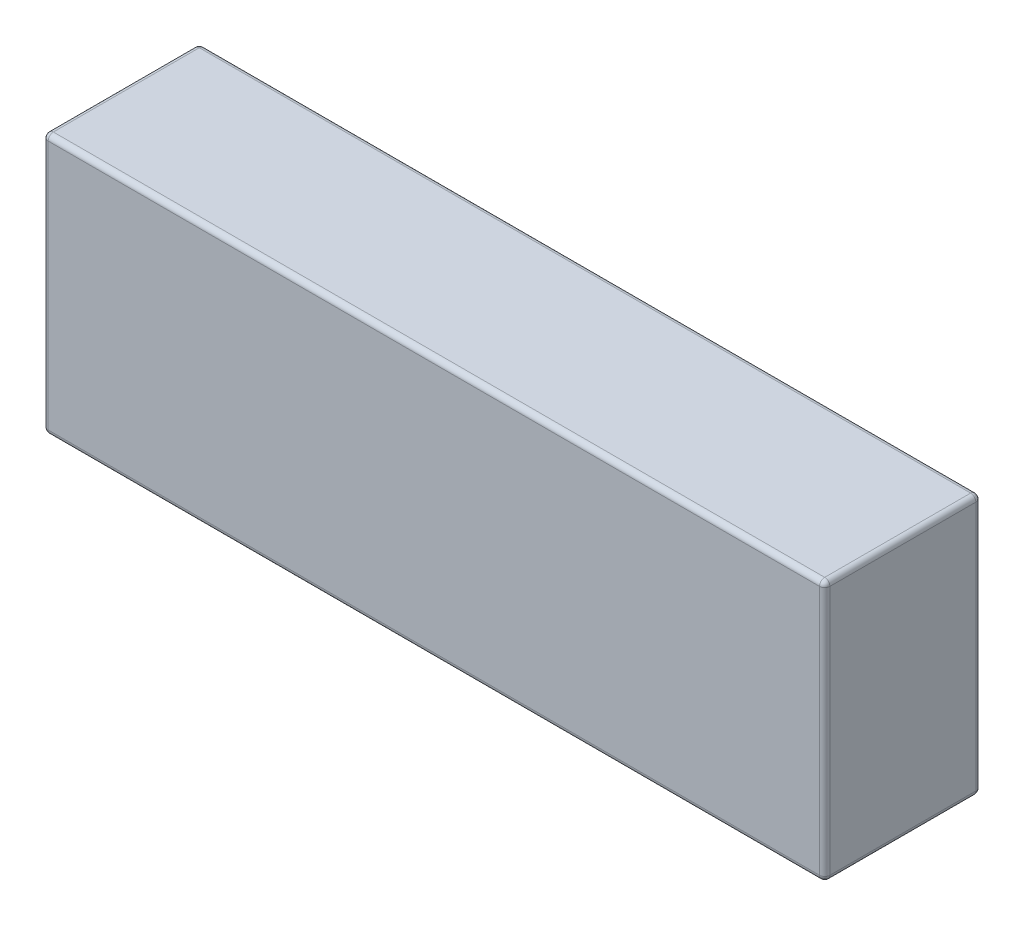
ISO-10303-21;
HEADER;
FILE_DESCRIPTION(('STEP AP214'),'2;1');
FILE_NAME('part.step','',(''),(''),'','','');
FILE_SCHEMA(('AUTOMOTIVE_DESIGN { 1 0 10303 214 1 1 1 1 }'));
ENDSEC;
DATA;
#1=APPLICATION_CONTEXT('core data for automotive mechanical design processes');
#2=APPLICATION_PROTOCOL_DEFINITION('international standard','automotive_design',2000,#1);
#3=PRODUCT_CONTEXT('',#1,'mechanical');
#4=PRODUCT('Part','Part','',(#3));
#5=PRODUCT_RELATED_PRODUCT_CATEGORY('part','',(#4));
#6=PRODUCT_DEFINITION_FORMATION('','',#4);
#7=PRODUCT_DEFINITION_CONTEXT('part definition',#1,'design');
#8=PRODUCT_DEFINITION('design','',#6,#7);
#9=PRODUCT_DEFINITION_SHAPE('','',#8);
#10=(LENGTH_UNIT() NAMED_UNIT(*) SI_UNIT(.MILLI.,.METRE.));
#11=(NAMED_UNIT(*) PLANE_ANGLE_UNIT() SI_UNIT($,.RADIAN.));
#12=(NAMED_UNIT(*) SI_UNIT($,.STERADIAN.) SOLID_ANGLE_UNIT());
#13=UNCERTAINTY_MEASURE_WITH_UNIT(LENGTH_MEASURE(1.E-05),#10,'distance_accuracy_value','');
#14=(GEOMETRIC_REPRESENTATION_CONTEXT(3) GLOBAL_UNCERTAINTY_ASSIGNED_CONTEXT((#13)) GLOBAL_UNIT_ASSIGNED_CONTEXT((#10,
#11,#12)) REPRESENTATION_CONTEXT('',''));
#15=CARTESIAN_POINT('',(0.,0.,0.));
#16=DIRECTION('',(0.,0.,1.));
#17=DIRECTION('',(1.,0.,0.));
#18=AXIS2_PLACEMENT_3D('',#15,#16,#17);
#19=CARTESIAN_POINT('',(75.,25.,28.));
#20=DIRECTION('',(-1.,0.,0.));
#21=DIRECTION('',(0.,0.,1.));
#22=AXIS2_PLACEMENT_3D('',#19,#20,#21);
#23=PLANE('',#22);
#24=DIRECTION('',(0.,0.,-1.));
#25=VECTOR('',#24,1.);
#26=CARTESIAN_POINT('',(75.,-24.,28.));
#27=LINE('',#26,#25);
#28=CARTESIAN_POINT('',(75.,-24.,28.));
#29=VERTEX_POINT('',#28);
#30=CARTESIAN_POINT('',(75.,-24.,0.));
#31=VERTEX_POINT('',#30);
#32=EDGE_CURVE('E318',#29,#31,#27,.T.);
#33=ORIENTED_EDGE('',*,*,#32,.T.);
#34=DIRECTION('',(0.,-1.,0.));
#35=VECTOR('',#34,1.);
#36=CARTESIAN_POINT('',(75.,25.,0.));
#37=LINE('',#36,#35);
#38=CARTESIAN_POINT('',(75.,24.,0.));
#39=VERTEX_POINT('',#38);
#40=EDGE_CURVE('E313',#31,#39,#37,.F.);
#41=ORIENTED_EDGE('',*,*,#40,.T.);
#42=DIRECTION('',(0.,0.,-1.));
#43=VECTOR('',#42,1.);
#44=CARTESIAN_POINT('',(75.,24.,28.));
#45=LINE('',#44,#43);
#46=CARTESIAN_POINT('',(75.,24.,28.));
#47=VERTEX_POINT('',#46);
#48=EDGE_CURVE('E306',#39,#47,#45,.F.);
#49=ORIENTED_EDGE('',*,*,#48,.T.);
#50=DIRECTION('',(0.,1.,0.));
#51=VECTOR('',#50,1.);
#52=CARTESIAN_POINT('',(75.,-25.,28.));
#53=LINE('',#52,#51);
#54=EDGE_CURVE('E314',#47,#29,#53,.F.);
#55=ORIENTED_EDGE('',*,*,#54,.T.);
#56=EDGE_LOOP('',(#33,#41,#49,#55));
#57=FACE_BOUND('',#56,.T.);
#58=ADVANCED_FACE('F44',(#57),#23,.F.);
#59=CARTESIAN_POINT('',(-75.,25.,28.));
#60=DIRECTION('',(0.,-1.,0.));
#61=DIRECTION('',(0.,0.,-1.));
#62=AXIS2_PLACEMENT_3D('',#59,#60,#61);
#63=PLANE('',#62);
#64=DIRECTION('',(0.,0.,-1.));
#65=VECTOR('',#64,1.);
#66=CARTESIAN_POINT('',(74.,25.,28.));
#67=LINE('',#66,#65);
#68=CARTESIAN_POINT('',(74.,25.,28.));
#69=VERTEX_POINT('',#68);
#70=CARTESIAN_POINT('',(74.,25.,0.));
#71=VERTEX_POINT('',#70);
#72=EDGE_CURVE('E332',#69,#71,#67,.T.);
#73=ORIENTED_EDGE('',*,*,#72,.T.);
#74=DIRECTION('',(1.,0.,0.));
#75=VECTOR('',#74,1.);
#76=CARTESIAN_POINT('',(-75.,25.,0.));
#77=LINE('',#76,#75);
#78=CARTESIAN_POINT('',(-74.,25.,0.));
#79=VERTEX_POINT('',#78);
#80=EDGE_CURVE('E244',#71,#79,#77,.F.);
#81=ORIENTED_EDGE('',*,*,#80,.T.);
#82=DIRECTION('',(0.,0.,-1.));
#83=VECTOR('',#82,1.);
#84=CARTESIAN_POINT('',(-74.,25.,28.));
#85=LINE('',#84,#83);
#86=CARTESIAN_POINT('',(-74.,25.,28.));
#87=VERTEX_POINT('',#86);
#88=EDGE_CURVE('E323',#79,#87,#85,.F.);
#89=ORIENTED_EDGE('',*,*,#88,.T.);
#90=DIRECTION('',(-1.,0.,0.));
#91=VECTOR('',#90,1.);
#92=CARTESIAN_POINT('',(75.,25.,28.));
#93=LINE('',#92,#91);
#94=EDGE_CURVE('E326',#87,#69,#93,.F.);
#95=ORIENTED_EDGE('',*,*,#94,.T.);
#96=EDGE_LOOP('',(#73,#81,#89,#95));
#97=FACE_BOUND('',#96,.T.);
#98=ADVANCED_FACE('F364',(#97),#63,.F.);
#99=CARTESIAN_POINT('',(-75.,25.,28.));
#100=DIRECTION('',(1.,0.,0.));
#101=DIRECTION('',(0.,1.,0.));
#102=AXIS2_PLACEMENT_3D('',#99,#100,#101);
#103=PLANE('',#102);
#104=DIRECTION('',(0.,0.,-1.));
#105=VECTOR('',#104,1.);
#106=CARTESIAN_POINT('',(-75.,-24.,28.));
#107=LINE('',#106,#105);
#108=CARTESIAN_POINT('',(-75.,-24.,0.));
#109=VERTEX_POINT('',#108);
#110=CARTESIAN_POINT('',(-75.,-24.,28.));
#111=VERTEX_POINT('',#110);
#112=EDGE_CURVE('E54',#109,#111,#107,.F.);
#113=ORIENTED_EDGE('',*,*,#112,.T.);
#114=DIRECTION('',(0.,-1.,0.));
#115=VECTOR('',#114,1.);
#116=CARTESIAN_POINT('',(-75.,25.,28.));
#117=LINE('',#116,#115);
#118=CARTESIAN_POINT('',(-75.,24.,28.));
#119=VERTEX_POINT('',#118);
#120=EDGE_CURVE('E11',#111,#119,#117,.F.);
#121=ORIENTED_EDGE('',*,*,#120,.T.);
#122=DIRECTION('',(0.,0.,-1.));
#123=VECTOR('',#122,1.);
#124=CARTESIAN_POINT('',(-75.,24.,28.));
#125=LINE('',#124,#123);
#126=CARTESIAN_POINT('',(-75.,24.,0.));
#127=VERTEX_POINT('',#126);
#128=EDGE_CURVE('E272',#119,#127,#125,.T.);
#129=ORIENTED_EDGE('',*,*,#128,.T.);
#130=DIRECTION('',(0.,1.,0.));
#131=VECTOR('',#130,1.);
#132=CARTESIAN_POINT('',(-75.,-25.,0.));
#133=LINE('',#132,#131);
#134=EDGE_CURVE('E65',#127,#109,#133,.F.);
#135=ORIENTED_EDGE('',*,*,#134,.T.);
#136=EDGE_LOOP('',(#113,#121,#129,#135));
#137=FACE_BOUND('',#136,.T.);
#138=ADVANCED_FACE('F384',(#137),#103,.F.);
#139=CARTESIAN_POINT('',(-75.,-25.,28.));
#140=DIRECTION('',(0.,1.,0.));
#141=DIRECTION('',(0.,0.,1.));
#142=AXIS2_PLACEMENT_3D('',#139,#140,#141);
#143=PLANE('',#142);
#144=DIRECTION('',(0.,0.,-1.));
#145=VECTOR('',#144,1.);
#146=CARTESIAN_POINT('',(74.,-25.,28.));
#147=LINE('',#146,#145);
#148=CARTESIAN_POINT('',(74.,-25.,0.));
#149=VERTEX_POINT('',#148);
#150=CARTESIAN_POINT('',(74.,-25.,28.));
#151=VERTEX_POINT('',#150);
#152=EDGE_CURVE('E265',#149,#151,#147,.F.);
#153=ORIENTED_EDGE('',*,*,#152,.T.);
#154=DIRECTION('',(1.,0.,0.));
#155=VECTOR('',#154,1.);
#156=CARTESIAN_POINT('',(-75.,-25.,28.));
#157=LINE('',#156,#155);
#158=CARTESIAN_POINT('',(-74.,-25.,28.));
#159=VERTEX_POINT('',#158);
#160=EDGE_CURVE('E268',#151,#159,#157,.F.);
#161=ORIENTED_EDGE('',*,*,#160,.T.);
#162=DIRECTION('',(0.,0.,-1.));
#163=VECTOR('',#162,1.);
#164=CARTESIAN_POINT('',(-74.,-25.,28.));
#165=LINE('',#164,#163);
#166=CARTESIAN_POINT('',(-74.,-25.,0.));
#167=VERTEX_POINT('',#166);
#168=EDGE_CURVE('E255',#159,#167,#165,.T.);
#169=ORIENTED_EDGE('',*,*,#168,.T.);
#170=DIRECTION('',(-1.,0.,0.));
#171=VECTOR('',#170,1.);
#172=CARTESIAN_POINT('',(75.,-25.,0.));
#173=LINE('',#172,#171);
#174=EDGE_CURVE('E167',#167,#149,#173,.F.);
#175=ORIENTED_EDGE('',*,*,#174,.T.);
#176=EDGE_LOOP('',(#153,#161,#169,#175));
#177=FACE_BOUND('',#176,.T.);
#178=ADVANCED_FACE('F589',(#177),#143,.F.);
#179=CARTESIAN_POINT('',(0.,0.,29.));
#180=DIRECTION('',(0.,0.,1.));
#181=DIRECTION('',(1.,0.,0.));
#182=AXIS2_PLACEMENT_3D('',#179,#180,#181);
#183=PLANE('',#182);
#184=DIRECTION('',(0.,1.,0.));
#185=VECTOR('',#184,1.);
#186=CARTESIAN_POINT('',(74.,25.,29.));
#187=LINE('',#186,#185);
#188=CARTESIAN_POINT('',(74.,-24.,29.));
#189=VERTEX_POINT('',#188);
#190=CARTESIAN_POINT('',(74.,24.,29.));
#191=VERTEX_POINT('',#190);
#192=EDGE_CURVE('E250',#189,#191,#187,.T.);
#193=ORIENTED_EDGE('',*,*,#192,.T.);
#194=DIRECTION('',(-1.,0.,0.));
#195=VECTOR('',#194,1.);
#196=CARTESIAN_POINT('',(-75.,24.,29.));
#197=LINE('',#196,#195);
#198=CARTESIAN_POINT('',(-74.,24.,29.));
#199=VERTEX_POINT('',#198);
#200=EDGE_CURVE('E247',#191,#199,#197,.T.);
#201=ORIENTED_EDGE('',*,*,#200,.T.);
#202=DIRECTION('',(0.,-1.,0.));
#203=VECTOR('',#202,1.);
#204=CARTESIAN_POINT('',(-74.,-25.,29.));
#205=LINE('',#204,#203);
#206=CARTESIAN_POINT('',(-74.,-24.,29.));
#207=VERTEX_POINT('',#206);
#208=EDGE_CURVE('E239',#199,#207,#205,.T.);
#209=ORIENTED_EDGE('',*,*,#208,.T.);
#210=DIRECTION('',(1.,0.,0.));
#211=VECTOR('',#210,1.);
#212=CARTESIAN_POINT('',(75.,-24.,29.));
#213=LINE('',#212,#211);
#214=EDGE_CURVE('E243',#207,#189,#213,.T.);
#215=ORIENTED_EDGE('',*,*,#214,.T.);
#216=EDGE_LOOP('',(#193,#201,#209,#215));
#217=FACE_BOUND('',#216,.T.);
#218=ADVANCED_FACE('F248',(#217),#183,.T.);
#219=CARTESIAN_POINT('',(0.,0.,-1.));
#220=DIRECTION('',(0.,0.,-1.));
#221=DIRECTION('',(-1.,0.,0.));
#222=AXIS2_PLACEMENT_3D('',#219,#220,#221);
#223=PLANE('',#222);
#224=DIRECTION('',(1.,0.,0.));
#225=VECTOR('',#224,1.);
#226=CARTESIAN_POINT('',(75.,24.,-1.));
#227=LINE('',#226,#225);
#228=CARTESIAN_POINT('',(-74.,24.,-1.));
#229=VERTEX_POINT('',#228);
#230=CARTESIAN_POINT('',(74.,24.,-1.));
#231=VERTEX_POINT('',#230);
#232=EDGE_CURVE('E144',#229,#231,#227,.T.);
#233=ORIENTED_EDGE('',*,*,#232,.T.);
#234=DIRECTION('',(0.,-1.,0.));
#235=VECTOR('',#234,1.);
#236=CARTESIAN_POINT('',(74.,-25.,-1.));
#237=LINE('',#236,#235);
#238=CARTESIAN_POINT('',(74.,-24.,-1.));
#239=VERTEX_POINT('',#238);
#240=EDGE_CURVE('E139',#231,#239,#237,.T.);
#241=ORIENTED_EDGE('',*,*,#240,.T.);
#242=DIRECTION('',(-1.,0.,0.));
#243=VECTOR('',#242,1.);
#244=CARTESIAN_POINT('',(-75.,-24.,-1.));
#245=LINE('',#244,#243);
#246=CARTESIAN_POINT('',(-74.,-24.,-1.));
#247=VERTEX_POINT('',#246);
#248=EDGE_CURVE('E133',#239,#247,#245,.T.);
#249=ORIENTED_EDGE('',*,*,#248,.T.);
#250=DIRECTION('',(0.,1.,0.));
#251=VECTOR('',#250,1.);
#252=CARTESIAN_POINT('',(-74.,25.,-1.));
#253=LINE('',#252,#251);
#254=EDGE_CURVE('E136',#247,#229,#253,.T.);
#255=ORIENTED_EDGE('',*,*,#254,.T.);
#256=EDGE_LOOP('',(#233,#241,#249,#255));
#257=FACE_BOUND('',#256,.T.);
#258=ADVANCED_FACE('F135',(#257),#223,.T.);
#259=CARTESIAN_POINT('',(-74.,0.,28.));
#260=DIRECTION('',(0.,1.,0.));
#261=DIRECTION('',(-1.,0.,0.));
#262=AXIS2_PLACEMENT_3D('',#259,#260,#261);
#263=CYLINDRICAL_SURFACE('',#262,1.);
#264=CARTESIAN_POINT('',(-74.,24.,28.));
#265=DIRECTION('',(0.,1.,0.));
#266=DIRECTION('',(0.,0.,1.));
#267=AXIS2_PLACEMENT_3D('',#264,#265,#266);
#268=CIRCLE('',#267,1.);
#269=EDGE_CURVE('E48',#119,#199,#268,.T.);
#270=ORIENTED_EDGE('',*,*,#269,.F.);
#271=ORIENTED_EDGE('',*,*,#120,.F.);
#272=CARTESIAN_POINT('',(-74.,-24.,28.));
#273=DIRECTION('',(0.,-1.,0.));
#274=DIRECTION('',(0.,0.,-1.));
#275=AXIS2_PLACEMENT_3D('',#272,#273,#274);
#276=CIRCLE('',#275,1.);
#277=EDGE_CURVE('E222',#207,#111,#276,.T.);
#278=ORIENTED_EDGE('',*,*,#277,.F.);
#279=ORIENTED_EDGE('',*,*,#208,.F.);
#280=EDGE_LOOP('',(#270,#271,#278,#279));
#281=FACE_BOUND('',#280,.T.);
#282=ADVANCED_FACE('F46',(#281),#263,.T.);
#283=CARTESIAN_POINT('',(-74.,24.,28.));
#284=DIRECTION('',(0.,0.,1.));
#285=DIRECTION('',(1.,0.,0.));
#286=AXIS2_PLACEMENT_3D('',#283,#284,#285);
#287=SPHERICAL_SURFACE('',#286,1.);
#288=CARTESIAN_POINT('',(-74.,24.,28.));
#289=DIRECTION('',(0.,0.,1.));
#290=DIRECTION('',(1.,0.,0.));
#291=AXIS2_PLACEMENT_3D('',#288,#289,#290);
#292=CIRCLE('',#291,1.);
#293=EDGE_CURVE('E216',#119,#87,#292,.F.);
#294=ORIENTED_EDGE('',*,*,#293,.F.);
#295=ORIENTED_EDGE('',*,*,#269,.T.);
#296=CARTESIAN_POINT('',(-74.,24.,28.));
#297=DIRECTION('',(-1.,0.,0.));
#298=DIRECTION('',(0.,-1.,0.));
#299=AXIS2_PLACEMENT_3D('',#296,#297,#298);
#300=CIRCLE('',#299,1.);
#301=EDGE_CURVE('E220',#87,#199,#300,.F.);
#302=ORIENTED_EDGE('',*,*,#301,.F.);
#303=EDGE_LOOP('',(#294,#295,#302));
#304=FACE_BOUND('',#303,.T.);
#305=ADVANCED_FACE('F236',(#304),#287,.T.);
#306=CARTESIAN_POINT('',(-74.,-24.,28.));
#307=DIRECTION('',(-1.,0.,0.));
#308=DIRECTION('',(0.,0.,1.));
#309=AXIS2_PLACEMENT_3D('',#306,#307,#308);
#310=SPHERICAL_SURFACE('',#309,1.);
#311=CARTESIAN_POINT('',(-74.,-24.,28.));
#312=DIRECTION('',(-1.,0.,0.));
#313=DIRECTION('',(0.,0.,1.));
#314=AXIS2_PLACEMENT_3D('',#311,#312,#313);
#315=CIRCLE('',#314,1.);
#316=EDGE_CURVE('E208',#207,#159,#315,.F.);
#317=ORIENTED_EDGE('',*,*,#316,.F.);
#318=ORIENTED_EDGE('',*,*,#277,.T.);
#319=CARTESIAN_POINT('',(-74.,-24.,28.));
#320=DIRECTION('',(0.,0.,1.));
#321=DIRECTION('',(1.,0.,0.));
#322=AXIS2_PLACEMENT_3D('',#319,#320,#321);
#323=CIRCLE('',#322,1.);
#324=EDGE_CURVE('E212',#159,#111,#323,.F.);
#325=ORIENTED_EDGE('',*,*,#324,.F.);
#326=EDGE_LOOP('',(#317,#318,#325));
#327=FACE_BOUND('',#326,.T.);
#328=ADVANCED_FACE('F548',(#327),#310,.T.);
#329=CARTESIAN_POINT('',(0.,24.,28.));
#330=DIRECTION('',(1.,0.,0.));
#331=DIRECTION('',(0.,0.,-1.));
#332=AXIS2_PLACEMENT_3D('',#329,#330,#331);
#333=CYLINDRICAL_SURFACE('',#332,1.);
#334=ORIENTED_EDGE('',*,*,#301,.T.);
#335=ORIENTED_EDGE('',*,*,#200,.F.);
#336=CARTESIAN_POINT('',(74.,24.,28.));
#337=DIRECTION('',(1.,0.,0.));
#338=DIRECTION('',(0.,0.,-1.));
#339=AXIS2_PLACEMENT_3D('',#336,#337,#338);
#340=CIRCLE('',#339,1.);
#341=EDGE_CURVE('E200',#69,#191,#340,.T.);
#342=ORIENTED_EDGE('',*,*,#341,.F.);
#343=ORIENTED_EDGE('',*,*,#94,.F.);
#344=EDGE_LOOP('',(#334,#335,#342,#343));
#345=FACE_BOUND('',#344,.T.);
#346=ADVANCED_FACE('F366',(#345),#333,.T.);
#347=CARTESIAN_POINT('',(-74.,24.,28.));
#348=DIRECTION('',(0.,0.,-1.));
#349=DIRECTION('',(-1.,0.,0.));
#350=AXIS2_PLACEMENT_3D('',#347,#348,#349);
#351=CYLINDRICAL_SURFACE('',#350,1.);
#352=ORIENTED_EDGE('',*,*,#293,.T.);
#353=ORIENTED_EDGE('',*,*,#88,.F.);
#354=CARTESIAN_POINT('',(-74.,24.,0.));
#355=DIRECTION('',(0.,0.,-1.));
#356=DIRECTION('',(-1.,0.,0.));
#357=AXIS2_PLACEMENT_3D('',#354,#355,#356);
#358=CIRCLE('',#357,1.);
#359=EDGE_CURVE('E196',#127,#79,#358,.T.);
#360=ORIENTED_EDGE('',*,*,#359,.F.);
#361=ORIENTED_EDGE('',*,*,#128,.F.);
#362=EDGE_LOOP('',(#352,#353,#360,#361));
#363=FACE_BOUND('',#362,.T.);
#364=ADVANCED_FACE('F528',(#363),#351,.T.);
#365=CARTESIAN_POINT('',(-74.,0.,0.));
#366=DIRECTION('',(0.,-1.,0.));
#367=DIRECTION('',(1.,0.,0.));
#368=AXIS2_PLACEMENT_3D('',#365,#366,#367);
#369=CYLINDRICAL_SURFACE('',#368,1.);
#370=CARTESIAN_POINT('',(-74.,-24.,0.));
#371=DIRECTION('',(0.,-1.,0.));
#372=DIRECTION('',(0.,0.,-1.));
#373=AXIS2_PLACEMENT_3D('',#370,#371,#372);
#374=CIRCLE('',#373,1.);
#375=EDGE_CURVE('E150',#109,#247,#374,.T.);
#376=ORIENTED_EDGE('',*,*,#375,.F.);
#377=ORIENTED_EDGE('',*,*,#134,.F.);
#378=CARTESIAN_POINT('',(-74.,24.,0.));
#379=DIRECTION('',(0.,1.,0.));
#380=DIRECTION('',(0.,0.,1.));
#381=AXIS2_PLACEMENT_3D('',#378,#379,#380);
#382=CIRCLE('',#381,1.);
#383=EDGE_CURVE('E153',#229,#127,#382,.T.);
#384=ORIENTED_EDGE('',*,*,#383,.F.);
#385=ORIENTED_EDGE('',*,*,#254,.F.);
#386=EDGE_LOOP('',(#376,#377,#384,#385));
#387=FACE_BOUND('',#386,.T.);
#388=ADVANCED_FACE('F149',(#387),#369,.T.);
#389=CARTESIAN_POINT('',(-74.,-24.,28.));
#390=DIRECTION('',(0.,0.,-1.));
#391=DIRECTION('',(-1.,0.,0.));
#392=AXIS2_PLACEMENT_3D('',#389,#390,#391);
#393=CYLINDRICAL_SURFACE('',#392,1.);
#394=ORIENTED_EDGE('',*,*,#324,.T.);
#395=ORIENTED_EDGE('',*,*,#112,.F.);
#396=CARTESIAN_POINT('',(-74.,-24.,0.));
#397=DIRECTION('',(0.,0.,-1.));
#398=DIRECTION('',(-1.,0.,0.));
#399=AXIS2_PLACEMENT_3D('',#396,#397,#398);
#400=CIRCLE('',#399,1.);
#401=EDGE_CURVE('E163',#167,#109,#400,.T.);
#402=ORIENTED_EDGE('',*,*,#401,.F.);
#403=ORIENTED_EDGE('',*,*,#168,.F.);
#404=EDGE_LOOP('',(#394,#395,#402,#403));
#405=FACE_BOUND('',#404,.T.);
#406=ADVANCED_FACE('F508',(#405),#393,.T.);
#407=CARTESIAN_POINT('',(0.,-24.,28.));
#408=DIRECTION('',(-1.,0.,0.));
#409=DIRECTION('',(0.,0.,1.));
#410=AXIS2_PLACEMENT_3D('',#407,#408,#409);
#411=CYLINDRICAL_SURFACE('',#410,1.);
#412=ORIENTED_EDGE('',*,*,#316,.T.);
#413=ORIENTED_EDGE('',*,*,#160,.F.);
#414=CARTESIAN_POINT('',(74.,-24.,28.));
#415=DIRECTION('',(1.,0.,0.));
#416=DIRECTION('',(0.,0.,-1.));
#417=AXIS2_PLACEMENT_3D('',#414,#415,#416);
#418=CIRCLE('',#417,1.);
#419=EDGE_CURVE('E188',#189,#151,#418,.T.);
#420=ORIENTED_EDGE('',*,*,#419,.F.);
#421=ORIENTED_EDGE('',*,*,#214,.F.);
#422=EDGE_LOOP('',(#412,#413,#420,#421));
#423=FACE_BOUND('',#422,.T.);
#424=ADVANCED_FACE('F346',(#423),#411,.T.);
#425=CARTESIAN_POINT('',(74.,0.,28.));
#426=DIRECTION('',(0.,-1.,0.));
#427=DIRECTION('',(0.,0.,-1.));
#428=AXIS2_PLACEMENT_3D('',#425,#426,#427);
#429=CYLINDRICAL_SURFACE('',#428,1.);
#430=CARTESIAN_POINT('',(74.,24.,28.));
#431=DIRECTION('',(0.,1.,0.));
#432=DIRECTION('',(0.,0.,1.));
#433=AXIS2_PLACEMENT_3D('',#430,#431,#432);
#434=CIRCLE('',#433,1.);
#435=EDGE_CURVE('E204',#191,#47,#434,.T.);
#436=ORIENTED_EDGE('',*,*,#435,.F.);
#437=ORIENTED_EDGE('',*,*,#192,.F.);
#438=CARTESIAN_POINT('',(74.,-24.,28.));
#439=DIRECTION('',(0.,-1.,0.));
#440=DIRECTION('',(0.,0.,-1.));
#441=AXIS2_PLACEMENT_3D('',#438,#439,#440);
#442=CIRCLE('',#441,1.);
#443=EDGE_CURVE('E184',#29,#189,#442,.T.);
#444=ORIENTED_EDGE('',*,*,#443,.F.);
#445=ORIENTED_EDGE('',*,*,#54,.F.);
#446=EDGE_LOOP('',(#436,#437,#444,#445));
#447=FACE_BOUND('',#446,.T.);
#448=ADVANCED_FACE('F343',(#447),#429,.T.);
#449=CARTESIAN_POINT('',(74.,24.,28.));
#450=DIRECTION('',(0.,0.,1.));
#451=DIRECTION('',(1.,0.,0.));
#452=AXIS2_PLACEMENT_3D('',#449,#450,#451);
#453=SPHERICAL_SURFACE('',#452,1.);
#454=ORIENTED_EDGE('',*,*,#341,.T.);
#455=ORIENTED_EDGE('',*,*,#435,.T.);
#456=CARTESIAN_POINT('',(74.,24.,28.));
#457=DIRECTION('',(0.,0.,1.));
#458=DIRECTION('',(1.,0.,0.));
#459=AXIS2_PLACEMENT_3D('',#456,#457,#458);
#460=CIRCLE('',#459,1.);
#461=EDGE_CURVE('E174',#69,#47,#460,.F.);
#462=ORIENTED_EDGE('',*,*,#461,.F.);
#463=EDGE_LOOP('',(#454,#455,#462));
#464=FACE_BOUND('',#463,.T.);
#465=ADVANCED_FACE('F368',(#464),#453,.T.);
#466=CARTESIAN_POINT('',(-74.,24.,0.));
#467=DIRECTION('',(-1.,0.,0.));
#468=DIRECTION('',(0.,0.,1.));
#469=AXIS2_PLACEMENT_3D('',#466,#467,#468);
#470=SPHERICAL_SURFACE('',#469,1.);
#471=ORIENTED_EDGE('',*,*,#383,.T.);
#472=ORIENTED_EDGE('',*,*,#359,.T.);
#473=CARTESIAN_POINT('',(-74.,24.,0.));
#474=DIRECTION('',(-1.,0.,0.));
#475=DIRECTION('',(0.,0.,1.));
#476=AXIS2_PLACEMENT_3D('',#473,#474,#475);
#477=CIRCLE('',#476,1.);
#478=EDGE_CURVE('E169',#229,#79,#477,.F.);
#479=ORIENTED_EDGE('',*,*,#478,.F.);
#480=EDGE_LOOP('',(#471,#472,#479));
#481=FACE_BOUND('',#480,.T.);
#482=ADVANCED_FACE('F370',(#481),#470,.T.);
#483=CARTESIAN_POINT('',(-74.,-24.,0.));
#484=DIRECTION('',(-1.,0.,0.));
#485=DIRECTION('',(0.,0.,1.));
#486=AXIS2_PLACEMENT_3D('',#483,#484,#485);
#487=SPHERICAL_SURFACE('',#486,1.);
#488=ORIENTED_EDGE('',*,*,#401,.T.);
#489=ORIENTED_EDGE('',*,*,#375,.T.);
#490=CARTESIAN_POINT('',(-74.,-24.,0.));
#491=DIRECTION('',(-1.,0.,0.));
#492=DIRECTION('',(0.,-1.,0.));
#493=AXIS2_PLACEMENT_3D('',#490,#491,#492);
#494=CIRCLE('',#493,1.);
#495=EDGE_CURVE('E160',#167,#247,#494,.F.);
#496=ORIENTED_EDGE('',*,*,#495,.F.);
#497=EDGE_LOOP('',(#488,#489,#496));
#498=FACE_BOUND('',#497,.T.);
#499=ADVANCED_FACE('F159',(#498),#487,.T.);
#500=CARTESIAN_POINT('',(74.,-24.,28.));
#501=DIRECTION('',(0.,0.,1.));
#502=DIRECTION('',(1.,0.,0.));
#503=AXIS2_PLACEMENT_3D('',#500,#501,#502);
#504=SPHERICAL_SURFACE('',#503,1.);
#505=ORIENTED_EDGE('',*,*,#443,.T.);
#506=ORIENTED_EDGE('',*,*,#419,.T.);
#507=CARTESIAN_POINT('',(74.,-24.,28.));
#508=DIRECTION('',(0.,0.,1.));
#509=DIRECTION('',(1.,0.,0.));
#510=AXIS2_PLACEMENT_3D('',#507,#508,#509);
#511=CIRCLE('',#510,1.);
#512=EDGE_CURVE('E170',#29,#151,#511,.F.);
#513=ORIENTED_EDGE('',*,*,#512,.F.);
#514=EDGE_LOOP('',(#505,#506,#513));
#515=FACE_BOUND('',#514,.T.);
#516=ADVANCED_FACE('F348',(#515),#504,.T.);
#517=CARTESIAN_POINT('',(74.,24.,28.));
#518=DIRECTION('',(0.,0.,-1.));
#519=DIRECTION('',(-1.,0.,0.));
#520=AXIS2_PLACEMENT_3D('',#517,#518,#519);
#521=CYLINDRICAL_SURFACE('',#520,1.);
#522=ORIENTED_EDGE('',*,*,#461,.T.);
#523=ORIENTED_EDGE('',*,*,#48,.F.);
#524=CARTESIAN_POINT('',(74.,24.,0.));
#525=DIRECTION('',(0.,0.,-1.));
#526=DIRECTION('',(-1.,0.,0.));
#527=AXIS2_PLACEMENT_3D('',#524,#525,#526);
#528=CIRCLE('',#527,1.);
#529=EDGE_CURVE('E177',#71,#39,#528,.T.);
#530=ORIENTED_EDGE('',*,*,#529,.F.);
#531=ORIENTED_EDGE('',*,*,#72,.F.);
#532=EDGE_LOOP('',(#522,#523,#530,#531));
#533=FACE_BOUND('',#532,.T.);
#534=ADVANCED_FACE('F308',(#533),#521,.T.);
#535=CARTESIAN_POINT('',(0.,24.,0.));
#536=DIRECTION('',(-1.,0.,0.));
#537=DIRECTION('',(0.,0.,1.));
#538=AXIS2_PLACEMENT_3D('',#535,#536,#537);
#539=CYLINDRICAL_SURFACE('',#538,1.);
#540=ORIENTED_EDGE('',*,*,#478,.T.);
#541=ORIENTED_EDGE('',*,*,#80,.F.);
#542=CARTESIAN_POINT('',(74.,24.,0.));
#543=DIRECTION('',(1.,0.,0.));
#544=DIRECTION('',(0.,0.,-1.));
#545=AXIS2_PLACEMENT_3D('',#542,#543,#544);
#546=CIRCLE('',#545,1.);
#547=EDGE_CURVE('E293',#231,#71,#546,.T.);
#548=ORIENTED_EDGE('',*,*,#547,.F.);
#549=ORIENTED_EDGE('',*,*,#232,.F.);
#550=EDGE_LOOP('',(#540,#541,#548,#549));
#551=FACE_BOUND('',#550,.T.);
#552=ADVANCED_FACE('F362',(#551),#539,.T.);
#553=CARTESIAN_POINT('',(0.,-24.,0.));
#554=DIRECTION('',(1.,0.,0.));
#555=DIRECTION('',(0.,0.,-1.));
#556=AXIS2_PLACEMENT_3D('',#553,#554,#555);
#557=CYLINDRICAL_SURFACE('',#556,1.);
#558=ORIENTED_EDGE('',*,*,#495,.T.);
#559=ORIENTED_EDGE('',*,*,#248,.F.);
#560=CARTESIAN_POINT('',(74.,-24.,0.));
#561=DIRECTION('',(1.,0.,0.));
#562=DIRECTION('',(0.,0.,-1.));
#563=AXIS2_PLACEMENT_3D('',#560,#561,#562);
#564=CIRCLE('',#563,1.);
#565=EDGE_CURVE('E289',#149,#239,#564,.T.);
#566=ORIENTED_EDGE('',*,*,#565,.F.);
#567=ORIENTED_EDGE('',*,*,#174,.F.);
#568=EDGE_LOOP('',(#558,#559,#566,#567));
#569=FACE_BOUND('',#568,.T.);
#570=ADVANCED_FACE('F166',(#569),#557,.T.);
#571=CARTESIAN_POINT('',(74.,-24.,28.));
#572=DIRECTION('',(0.,0.,-1.));
#573=DIRECTION('',(-1.,0.,0.));
#574=AXIS2_PLACEMENT_3D('',#571,#572,#573);
#575=CYLINDRICAL_SURFACE('',#574,1.);
#576=ORIENTED_EDGE('',*,*,#512,.T.);
#577=ORIENTED_EDGE('',*,*,#152,.F.);
#578=CARTESIAN_POINT('',(74.,-24.,0.));
#579=DIRECTION('',(0.,0.,-1.));
#580=DIRECTION('',(-1.,0.,0.));
#581=AXIS2_PLACEMENT_3D('',#578,#579,#580);
#582=CIRCLE('',#581,1.);
#583=EDGE_CURVE('E285',#31,#149,#582,.T.);
#584=ORIENTED_EDGE('',*,*,#583,.F.);
#585=ORIENTED_EDGE('',*,*,#32,.F.);
#586=EDGE_LOOP('',(#576,#577,#584,#585));
#587=FACE_BOUND('',#586,.T.);
#588=ADVANCED_FACE('F351',(#587),#575,.T.);
#589=CARTESIAN_POINT('',(74.,24.,0.));
#590=DIRECTION('',(0.,1.,0.));
#591=DIRECTION('',(0.,0.,1.));
#592=AXIS2_PLACEMENT_3D('',#589,#590,#591);
#593=SPHERICAL_SURFACE('',#592,1.);
#594=ORIENTED_EDGE('',*,*,#547,.T.);
#595=ORIENTED_EDGE('',*,*,#529,.T.);
#596=CARTESIAN_POINT('',(74.,24.,0.));
#597=DIRECTION('',(0.,1.,0.));
#598=DIRECTION('',(0.,0.,1.));
#599=AXIS2_PLACEMENT_3D('',#596,#597,#598);
#600=CIRCLE('',#599,1.);
#601=EDGE_CURVE('E282',#231,#39,#600,.F.);
#602=ORIENTED_EDGE('',*,*,#601,.F.);
#603=EDGE_LOOP('',(#594,#595,#602));
#604=FACE_BOUND('',#603,.T.);
#605=ADVANCED_FACE('F302',(#604),#593,.T.);
#606=CARTESIAN_POINT('',(74.,-24.,0.));
#607=DIRECTION('',(0.,-1.,0.));
#608=DIRECTION('',(0.,0.,-1.));
#609=AXIS2_PLACEMENT_3D('',#606,#607,#608);
#610=SPHERICAL_SURFACE('',#609,1.);
#611=ORIENTED_EDGE('',*,*,#583,.T.);
#612=ORIENTED_EDGE('',*,*,#565,.T.);
#613=CARTESIAN_POINT('',(74.,-24.,0.));
#614=DIRECTION('',(0.,-1.,0.));
#615=DIRECTION('',(0.,0.,-1.));
#616=AXIS2_PLACEMENT_3D('',#613,#614,#615);
#617=CIRCLE('',#616,1.);
#618=EDGE_CURVE('E279',#31,#239,#617,.F.);
#619=ORIENTED_EDGE('',*,*,#618,.F.);
#620=EDGE_LOOP('',(#611,#612,#619));
#621=FACE_BOUND('',#620,.T.);
#622=ADVANCED_FACE('F391',(#621),#610,.T.);
#623=CARTESIAN_POINT('',(74.,0.,0.));
#624=DIRECTION('',(0.,1.,0.));
#625=DIRECTION('',(0.,0.,1.));
#626=AXIS2_PLACEMENT_3D('',#623,#624,#625);
#627=CYLINDRICAL_SURFACE('',#626,1.);
#628=ORIENTED_EDGE('',*,*,#601,.T.);
#629=ORIENTED_EDGE('',*,*,#40,.F.);
#630=ORIENTED_EDGE('',*,*,#618,.T.);
#631=ORIENTED_EDGE('',*,*,#240,.F.);
#632=EDGE_LOOP('',(#628,#629,#630,#631));
#633=FACE_BOUND('',#632,.T.);
#634=ADVANCED_FACE('F388',(#633),#627,.T.);
#635=CLOSED_SHELL('',(#58,#98,#138,#178,#218,#258,#282,#305,#328,#346,#364,#388,#406,#424,#448,
#465,#482,#499,#516,#534,#552,#570,#588,#605,#622,#634));
#636=MANIFOLD_SOLID_BREP('B2',#635);
#637=ADVANCED_BREP_SHAPE_REPRESENTATION('',(#18,#636),#14);
#638=SHAPE_DEFINITION_REPRESENTATION(#9,#637);
ENDSEC;
END-ISO-10303-21;
